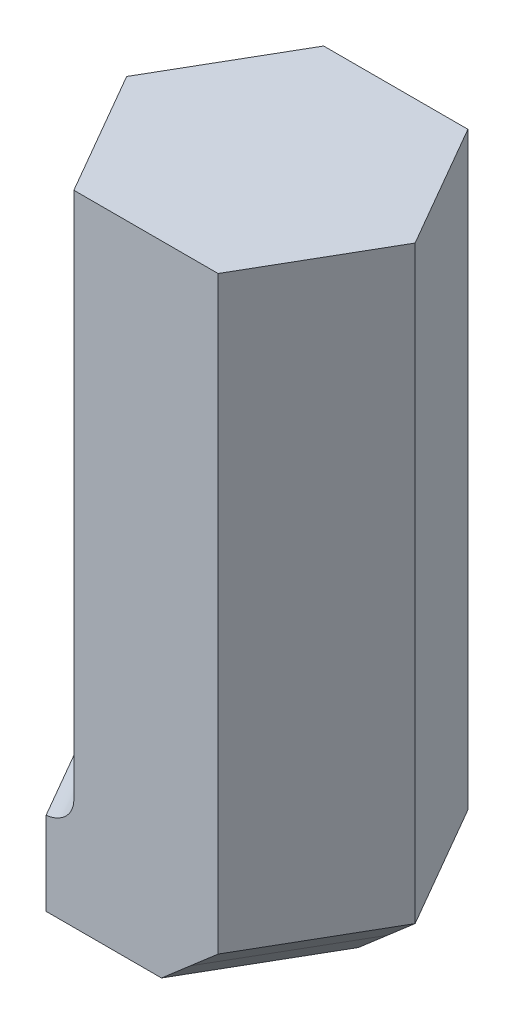
ISO-10303-21;
HEADER;
FILE_DESCRIPTION(('STEP AP214'),'2;1');
FILE_NAME('part.step','',(''),(''),'','','');
FILE_SCHEMA(('AUTOMOTIVE_DESIGN { 1 0 10303 214 1 1 1 1 }'));
ENDSEC;
DATA;
#1=APPLICATION_CONTEXT('core data for automotive mechanical design processes');
#2=APPLICATION_PROTOCOL_DEFINITION('international standard','automotive_design',2000,#1);
#3=PRODUCT_CONTEXT('',#1,'mechanical');
#4=PRODUCT('Part','Part','',(#3));
#5=PRODUCT_RELATED_PRODUCT_CATEGORY('part','',(#4));
#6=PRODUCT_DEFINITION_FORMATION('','',#4);
#7=PRODUCT_DEFINITION_CONTEXT('part definition',#1,'design');
#8=PRODUCT_DEFINITION('design','',#6,#7);
#9=PRODUCT_DEFINITION_SHAPE('','',#8);
#10=(LENGTH_UNIT() NAMED_UNIT(*) SI_UNIT(.MILLI.,.METRE.));
#11=(NAMED_UNIT(*) PLANE_ANGLE_UNIT() SI_UNIT($,.RADIAN.));
#12=(NAMED_UNIT(*) SI_UNIT($,.STERADIAN.) SOLID_ANGLE_UNIT());
#13=UNCERTAINTY_MEASURE_WITH_UNIT(LENGTH_MEASURE(1.E-05),#10,'distance_accuracy_value','');
#14=(GEOMETRIC_REPRESENTATION_CONTEXT(3) GLOBAL_UNCERTAINTY_ASSIGNED_CONTEXT((#13)) GLOBAL_UNIT_ASSIGNED_CONTEXT((#10,
#11,#12)) REPRESENTATION_CONTEXT('',''));
#15=CARTESIAN_POINT('',(0.,0.,0.));
#16=DIRECTION('',(0.,0.,1.));
#17=DIRECTION('',(1.,0.,0.));
#18=AXIS2_PLACEMENT_3D('',#15,#16,#17);
#19=CARTESIAN_POINT('',(-2.59807621135335,20.,4.49999999999998));
#20=DIRECTION('',(0.,0.,-1.));
#21=DIRECTION('',(-1.,0.,0.));
#22=AXIS2_PLACEMENT_3D('',#19,#20,#21);
#23=PLANE('',#22);
#24=DIRECTION('',(-1.,0.,0.));
#25=VECTOR('',#24,1.);
#26=CARTESIAN_POINT('',(1.59807621135331,-3.,4.50000000000002));
#27=LINE('',#26,#25);
#28=CARTESIAN_POINT('',(0.558845726811986,-3.,4.50000000000002));
#29=VERTEX_POINT('',#28);
#30=CARTESIAN_POINT('',(-3.59807621135332,-3.,4.50000000000002));
#31=VERTEX_POINT('',#30);
#32=EDGE_CURVE('E144',#29,#31,#27,.T.);
#33=ORIENTED_EDGE('',*,*,#32,.F.);
#34=DIRECTION('',(0.755928946018452,0.65465367070798,0.));
#35=VECTOR('',#34,1.);
#36=CARTESIAN_POINT('',(1.59247185641883,-2.10485351374509,4.50000000000001));
#37=LINE('',#36,#35);
#38=CARTESIAN_POINT('',(1.59807621135331,-2.10000000000004,4.50000000000002));
#39=VERTEX_POINT('',#38);
#40=EDGE_CURVE('E209',#29,#39,#37,.T.);
#41=ORIENTED_EDGE('',*,*,#40,.T.);
#42=DIRECTION('',(-0.75592894601845,-0.654653670707983,0.));
#43=VECTOR('',#42,1.);
#44=CARTESIAN_POINT('',(10.1369384975988,5.2948716593055,4.50000000000007));
#45=LINE('',#44,#43);
#46=CARTESIAN_POINT('',(2.59807621135329,-1.23397459621562,4.50000000000002));
#47=VERTEX_POINT('',#46);
#48=EDGE_CURVE('E196',#39,#47,#45,.F.);
#49=ORIENTED_EDGE('',*,*,#48,.T.);
#50=DIRECTION('',(0.,-1.,0.));
#51=VECTOR('',#50,1.);
#52=CARTESIAN_POINT('',(2.59807621135329,20.,4.50000000000002));
#53=LINE('',#52,#51);
#54=CARTESIAN_POINT('',(2.59807621135329,20.,4.50000000000002));
#55=VERTEX_POINT('',#54);
#56=EDGE_CURVE('E183',#55,#47,#53,.T.);
#57=ORIENTED_EDGE('',*,*,#56,.F.);
#58=DIRECTION('',(1.,0.,0.));
#59=VECTOR('',#58,1.);
#60=CARTESIAN_POINT('',(-2.59807621135335,20.,4.49999999999998));
#61=LINE('',#60,#59);
#62=CARTESIAN_POINT('',(-2.59807621135335,20.,4.49999999999998));
#63=VERTEX_POINT('',#62);
#64=EDGE_CURVE('E154',#63,#55,#61,.T.);
#65=ORIENTED_EDGE('',*,*,#64,.F.);
#66=DIRECTION('',(0.,-1.,0.));
#67=VECTOR('',#66,1.);
#68=CARTESIAN_POINT('',(-2.59807621135335,20.,4.49999999999998));
#69=LINE('',#68,#67);
#70=CARTESIAN_POINT('',(-2.59807621135335,0.990984766567518,4.49999999999998));
#71=VERTEX_POINT('',#70);
#72=EDGE_CURVE('E172',#63,#71,#69,.T.);
#73=ORIENTED_EDGE('',*,*,#72,.T.);
#74=CARTESIAN_POINT('',(-3.75277674973258,0.990984766567519,4.49999999999997));
#75=DIRECTION('',(0.,0.,-1.));
#76=DIRECTION('',(1.,0.,0.));
#77=AXIS2_PLACEMENT_3D('',#74,#75,#76);
#78=ELLIPSE('',#77,1.15470053837926,1.);
#79=CARTESIAN_POINT('',(-3.59807621135332,0.,4.50000000000002));
#80=VERTEX_POINT('',#79);
#81=EDGE_CURVE('E46',#71,#80,#78,.T.);
#82=ORIENTED_EDGE('',*,*,#81,.T.);
#83=DIRECTION('',(0.,1.,0.));
#84=VECTOR('',#83,1.);
#85=CARTESIAN_POINT('',(-3.59807621135332,-3.,4.50000000000002));
#86=LINE('',#85,#84);
#87=EDGE_CURVE('E159',#31,#80,#86,.T.);
#88=ORIENTED_EDGE('',*,*,#87,.F.);
#89=EDGE_LOOP('',(#33,#41,#49,#57,#65,#73,#82,#88));
#90=FACE_BOUND('',#89,.T.);
#91=ADVANCED_FACE('F37',(#90),#23,.F.);
#92=CARTESIAN_POINT('',(2.59807621135329,20.,4.50000000000002));
#93=DIRECTION('',(-0.866025403784435,0.,-0.500000000000006));
#94=DIRECTION('',(-0.500000000000006,0.,0.866025403784435));
#95=AXIS2_PLACEMENT_3D('',#92,#93,#94);
#96=PLANE('',#95);
#97=ORIENTED_EDGE('',*,*,#56,.T.);
#98=DIRECTION('',(-0.500000000000006,0.,0.866025403784435));
#99=VECTOR('',#98,1.);
#100=CARTESIAN_POINT('',(2.59807621135336,-1.23397459621562,4.49999999999989));
#101=LINE('',#100,#99);
#102=CARTESIAN_POINT('',(5.19615242270663,-1.2339745962156,0.));
#103=VERTEX_POINT('',#102);
#104=EDGE_CURVE('E199',#47,#103,#101,.F.);
#105=ORIENTED_EDGE('',*,*,#104,.T.);
#106=DIRECTION('',(0.,-1.,0.));
#107=VECTOR('',#106,1.);
#108=CARTESIAN_POINT('',(5.19615242270663,20.,0.));
#109=LINE('',#108,#107);
#110=CARTESIAN_POINT('',(5.19615242270663,20.,0.));
#111=VERTEX_POINT('',#110);
#112=EDGE_CURVE('E181',#111,#103,#109,.T.);
#113=ORIENTED_EDGE('',*,*,#112,.F.);
#114=DIRECTION('',(0.500000000000006,0.,-0.866025403784435));
#115=VECTOR('',#114,1.);
#116=CARTESIAN_POINT('',(2.59807621135329,20.,4.50000000000002));
#117=LINE('',#116,#115);
#118=EDGE_CURVE('E157',#55,#111,#117,.T.);
#119=ORIENTED_EDGE('',*,*,#118,.F.);
#120=EDGE_LOOP('',(#97,#105,#113,#119));
#121=FACE_BOUND('',#120,.T.);
#122=ADVANCED_FACE('F250',(#121),#96,.F.);
#123=CARTESIAN_POINT('',(5.19615242270663,20.,0.));
#124=DIRECTION('',(-0.866025403784442,0.,0.499999999999994));
#125=DIRECTION('',(0.499999999999994,0.,0.866025403784442));
#126=AXIS2_PLACEMENT_3D('',#123,#124,#125);
#127=PLANE('',#126);
#128=ORIENTED_EDGE('',*,*,#112,.T.);
#129=DIRECTION('',(0.499999999999994,0.,0.866025403784442));
#130=VECTOR('',#129,1.);
#131=CARTESIAN_POINT('',(5.19615242270656,-1.23397459621559,0.));
#132=LINE('',#131,#130);
#133=CARTESIAN_POINT('',(2.59807621135335,-1.23397459621556,-4.49999999999998));
#134=VERTEX_POINT('',#133);
#135=EDGE_CURVE('E191',#103,#134,#132,.F.);
#136=ORIENTED_EDGE('',*,*,#135,.T.);
#137=DIRECTION('',(0.,-1.,0.));
#138=VECTOR('',#137,1.);
#139=CARTESIAN_POINT('',(2.59807621135335,20.,-4.49999999999998));
#140=LINE('',#139,#138);
#141=CARTESIAN_POINT('',(2.59807621135335,20.,-4.49999999999998));
#142=VERTEX_POINT('',#141);
#143=EDGE_CURVE('E179',#142,#134,#140,.T.);
#144=ORIENTED_EDGE('',*,*,#143,.F.);
#145=DIRECTION('',(-0.499999999999994,0.,-0.866025403784442));
#146=VECTOR('',#145,1.);
#147=CARTESIAN_POINT('',(5.19615242270663,20.,0.));
#148=LINE('',#147,#146);
#149=EDGE_CURVE('E164',#111,#142,#148,.T.);
#150=ORIENTED_EDGE('',*,*,#149,.F.);
#151=EDGE_LOOP('',(#128,#136,#144,#150));
#152=FACE_BOUND('',#151,.T.);
#153=ADVANCED_FACE('F257',(#152),#127,.F.);
#154=CARTESIAN_POINT('',(2.59807621135335,20.,-4.49999999999998));
#155=DIRECTION('',(0.,0.,1.));
#156=DIRECTION('',(1.,0.,0.));
#157=AXIS2_PLACEMENT_3D('',#154,#155,#156);
#158=PLANE('',#157);
#159=DIRECTION('',(0.755928946018452,0.65465367070798,0.));
#160=VECTOR('',#159,1.);
#161=CARTESIAN_POINT('',(13.1061684534311,7.86630023073404,-4.49999999999991));
#162=LINE('',#161,#160);
#163=CARTESIAN_POINT('',(1.59807621135332,-2.10000000000004,-4.49999999999998));
#164=VERTEX_POINT('',#163);
#165=EDGE_CURVE('E194',#134,#164,#162,.F.);
#166=ORIENTED_EDGE('',*,*,#165,.T.);
#167=DIRECTION('',(-0.755928946018455,-0.654653670707977,0.));
#168=VECTOR('',#167,1.);
#169=CARTESIAN_POINT('',(1.59247185641884,-2.10485351374507,-4.49999999999999));
#170=LINE('',#169,#168);
#171=CARTESIAN_POINT('',(0.558845726811986,-3.,-4.49999999999998));
#172=VERTEX_POINT('',#171);
#173=EDGE_CURVE('E211',#164,#172,#170,.T.);
#174=ORIENTED_EDGE('',*,*,#173,.T.);
#175=DIRECTION('',(1.,0.,0.));
#176=VECTOR('',#175,1.);
#177=CARTESIAN_POINT('',(-3.59807621135331,-3.,-4.49999999999998));
#178=LINE('',#177,#176);
#179=CARTESIAN_POINT('',(-3.59807621135331,-3.,-4.49999999999998));
#180=VERTEX_POINT('',#179);
#181=EDGE_CURVE('E137',#180,#172,#178,.T.);
#182=ORIENTED_EDGE('',*,*,#181,.F.);
#183=DIRECTION('',(0.,1.,0.));
#184=VECTOR('',#183,1.);
#185=CARTESIAN_POINT('',(-3.59807621135331,-3.,-4.49999999999998));
#186=LINE('',#185,#184);
#187=CARTESIAN_POINT('',(-3.59807621135331,0.,-4.49999999999998));
#188=VERTEX_POINT('',#187);
#189=EDGE_CURVE('E133',#180,#188,#186,.T.);
#190=ORIENTED_EDGE('',*,*,#189,.T.);
#191=CARTESIAN_POINT('',(-3.75277674973255,0.990984766567517,-4.50000000000003));
#192=DIRECTION('',(0.,0.,1.));
#193=DIRECTION('',(-1.,0.,0.));
#194=AXIS2_PLACEMENT_3D('',#191,#192,#193);
#195=ELLIPSE('',#194,1.15470053837925,1.);
#196=CARTESIAN_POINT('',(-2.59807621135328,0.990984766567518,-4.50000000000002));
#197=VERTEX_POINT('',#196);
#198=EDGE_CURVE('E11',#188,#197,#195,.T.);
#199=ORIENTED_EDGE('',*,*,#198,.T.);
#200=DIRECTION('',(0.,-1.,0.));
#201=VECTOR('',#200,1.);
#202=CARTESIAN_POINT('',(-2.59807621135328,20.,-4.50000000000002));
#203=LINE('',#202,#201);
#204=CARTESIAN_POINT('',(-2.59807621135328,20.,-4.50000000000002));
#205=VERTEX_POINT('',#204);
#206=EDGE_CURVE('E177',#205,#197,#203,.T.);
#207=ORIENTED_EDGE('',*,*,#206,.F.);
#208=DIRECTION('',(-1.,0.,0.));
#209=VECTOR('',#208,1.);
#210=CARTESIAN_POINT('',(2.59807621135335,20.,-4.49999999999998));
#211=LINE('',#210,#209);
#212=EDGE_CURVE('E166',#142,#205,#211,.T.);
#213=ORIENTED_EDGE('',*,*,#212,.F.);
#214=ORIENTED_EDGE('',*,*,#143,.T.);
#215=EDGE_LOOP('',(#166,#174,#182,#190,#199,#207,#213,#214));
#216=FACE_BOUND('',#215,.T.);
#217=ADVANCED_FACE('F266',(#216),#158,.F.);
#218=CARTESIAN_POINT('',(-2.59807621135328,20.,-4.50000000000002));
#219=DIRECTION('',(0.866025403784435,0.,0.500000000000006));
#220=DIRECTION('',(0.500000000000006,0.,-0.866025403784435));
#221=AXIS2_PLACEMENT_3D('',#218,#219,#220);
#222=PLANE('',#221);
#223=ORIENTED_EDGE('',*,*,#206,.T.);
#224=DIRECTION('',(-0.500000000000006,0.,0.866025403784435));
#225=VECTOR('',#224,1.);
#226=CARTESIAN_POINT('',(-2.59807621135328,0.990984766567518,-4.50000000000002));
#227=LINE('',#226,#225);
#228=CARTESIAN_POINT('',(-5.19615242270663,0.990984766567518,0.));
#229=VERTEX_POINT('',#228);
#230=EDGE_CURVE('E58',#197,#229,#227,.T.);
#231=ORIENTED_EDGE('',*,*,#230,.T.);
#232=DIRECTION('',(0.,-1.,0.));
#233=VECTOR('',#232,1.);
#234=CARTESIAN_POINT('',(-5.19615242270663,20.,0.));
#235=LINE('',#234,#233);
#236=CARTESIAN_POINT('',(-5.19615242270663,20.,0.));
#237=VERTEX_POINT('',#236);
#238=EDGE_CURVE('E175',#237,#229,#235,.T.);
#239=ORIENTED_EDGE('',*,*,#238,.F.);
#240=DIRECTION('',(-0.500000000000006,0.,0.866025403784435));
#241=VECTOR('',#240,1.);
#242=CARTESIAN_POINT('',(-2.59807621135328,20.,-4.50000000000002));
#243=LINE('',#242,#241);
#244=EDGE_CURVE('E168',#205,#237,#243,.T.);
#245=ORIENTED_EDGE('',*,*,#244,.F.);
#246=EDGE_LOOP('',(#223,#231,#239,#245));
#247=FACE_BOUND('',#246,.T.);
#248=ADVANCED_FACE('F268',(#247),#222,.F.);
#249=CARTESIAN_POINT('',(-5.19615242270663,20.,0.));
#250=DIRECTION('',(0.866025403784442,0.,-0.499999999999994));
#251=DIRECTION('',(-0.499999999999994,0.,-0.866025403784442));
#252=AXIS2_PLACEMENT_3D('',#249,#250,#251);
#253=PLANE('',#252);
#254=ORIENTED_EDGE('',*,*,#238,.T.);
#255=DIRECTION('',(0.499999999999994,0.,0.866025403784442));
#256=VECTOR('',#255,1.);
#257=CARTESIAN_POINT('',(-5.19615242270663,0.990984766567518,0.));
#258=LINE('',#257,#256);
#259=EDGE_CURVE('E213',#229,#71,#258,.T.);
#260=ORIENTED_EDGE('',*,*,#259,.T.);
#261=ORIENTED_EDGE('',*,*,#72,.F.);
#262=DIRECTION('',(0.499999999999994,0.,0.866025403784442));
#263=VECTOR('',#262,1.);
#264=CARTESIAN_POINT('',(-5.19615242270663,20.,0.));
#265=LINE('',#264,#263);
#266=EDGE_CURVE('E170',#237,#63,#265,.T.);
#267=ORIENTED_EDGE('',*,*,#266,.F.);
#268=EDGE_LOOP('',(#254,#260,#261,#267));
#269=FACE_BOUND('',#268,.T.);
#270=ADVANCED_FACE('F264',(#269),#253,.F.);
#271=CARTESIAN_POINT('',(0.,20.,0.));
#272=DIRECTION('',(0.,1.,0.));
#273=DIRECTION('',(0.,0.,1.));
#274=AXIS2_PLACEMENT_3D('',#271,#272,#273);
#275=PLANE('',#274);
#276=ORIENTED_EDGE('',*,*,#64,.T.);
#277=ORIENTED_EDGE('',*,*,#118,.T.);
#278=ORIENTED_EDGE('',*,*,#149,.T.);
#279=ORIENTED_EDGE('',*,*,#212,.T.);
#280=ORIENTED_EDGE('',*,*,#244,.T.);
#281=ORIENTED_EDGE('',*,*,#266,.T.);
#282=EDGE_LOOP('',(#276,#277,#278,#279,#280,#281));
#283=FACE_BOUND('',#282,.T.);
#284=ADVANCED_FACE('F260',(#283),#275,.T.);
#285=CARTESIAN_POINT('',(-3.59807621135332,-3.,4.50000000000002));
#286=DIRECTION('',(0.866025403784439,0.,-0.5));
#287=DIRECTION('',(-0.5,0.,-0.866025403784439));
#288=AXIS2_PLACEMENT_3D('',#285,#286,#287);
#289=PLANE('',#288);
#290=DIRECTION('',(-0.5,0.,-0.866025403784439));
#291=VECTOR('',#290,1.);
#292=CARTESIAN_POINT('',(-3.59807621135332,0.,4.50000000000002));
#293=LINE('',#292,#291);
#294=CARTESIAN_POINT('',(-6.19615242270663,0.,0.));
#295=VERTEX_POINT('',#294);
#296=EDGE_CURVE('E152',#80,#295,#293,.T.);
#297=ORIENTED_EDGE('',*,*,#296,.T.);
#298=DIRECTION('',(0.,1.,0.));
#299=VECTOR('',#298,1.);
#300=CARTESIAN_POINT('',(-6.19615242270663,-3.,0.));
#301=LINE('',#300,#299);
#302=CARTESIAN_POINT('',(-6.19615242270663,-3.,0.));
#303=VERTEX_POINT('',#302);
#304=EDGE_CURVE('E131',#303,#295,#301,.T.);
#305=ORIENTED_EDGE('',*,*,#304,.F.);
#306=DIRECTION('',(-0.5,0.,-0.866025403784439));
#307=VECTOR('',#306,1.);
#308=CARTESIAN_POINT('',(-3.59807621135332,-3.,4.50000000000002));
#309=LINE('',#308,#307);
#310=EDGE_CURVE('E138',#31,#303,#309,.T.);
#311=ORIENTED_EDGE('',*,*,#310,.F.);
#312=ORIENTED_EDGE('',*,*,#87,.T.);
#313=EDGE_LOOP('',(#297,#305,#311,#312));
#314=FACE_BOUND('',#313,.T.);
#315=ADVANCED_FACE('F150',(#314),#289,.F.);
#316=CARTESIAN_POINT('',(-6.19615242270663,-3.,0.));
#317=DIRECTION('',(0.866025403784438,0.,0.5));
#318=DIRECTION('',(0.5,0.,-0.866025403784438));
#319=AXIS2_PLACEMENT_3D('',#316,#317,#318);
#320=PLANE('',#319);
#321=DIRECTION('',(0.5,0.,-0.866025403784438));
#322=VECTOR('',#321,1.);
#323=CARTESIAN_POINT('',(-6.19615242270663,0.,0.));
#324=LINE('',#323,#322);
#325=EDGE_CURVE('E148',#295,#188,#324,.T.);
#326=ORIENTED_EDGE('',*,*,#325,.T.);
#327=ORIENTED_EDGE('',*,*,#189,.F.);
#328=DIRECTION('',(0.5,0.,-0.866025403784438));
#329=VECTOR('',#328,1.);
#330=CARTESIAN_POINT('',(-6.19615242270663,-3.,0.));
#331=LINE('',#330,#329);
#332=EDGE_CURVE('E127',#303,#180,#331,.T.);
#333=ORIENTED_EDGE('',*,*,#332,.F.);
#334=ORIENTED_EDGE('',*,*,#304,.T.);
#335=EDGE_LOOP('',(#326,#327,#333,#334));
#336=FACE_BOUND('',#335,.T.);
#337=ADVANCED_FACE('F129',(#336),#320,.F.);
#338=CARTESIAN_POINT('',(0.,-3.,0.));
#339=DIRECTION('',(0.,-1.,0.));
#340=DIRECTION('',(0.,0.,-1.));
#341=AXIS2_PLACEMENT_3D('',#338,#339,#340);
#342=PLANE('',#341);
#343=DIRECTION('',(0.5,0.,0.866025403784439));
#344=VECTOR('',#343,1.);
#345=CARTESIAN_POINT('',(3.41672955930063,-3.,0.450000000000022));
#346=LINE('',#345,#344);
#347=CARTESIAN_POINT('',(3.1569219381653,-3.,0.));
#348=VERTEX_POINT('',#347);
#349=EDGE_CURVE('E202',#172,#348,#346,.T.);
#350=ORIENTED_EDGE('',*,*,#349,.T.);
#351=DIRECTION('',(-0.5,0.,0.866025403784439));
#352=VECTOR('',#351,1.);
#353=CARTESIAN_POINT('',(0.818653347947318,-3.,4.05000000000002));
#354=LINE('',#353,#352);
#355=EDGE_CURVE('E207',#348,#29,#354,.T.);
#356=ORIENTED_EDGE('',*,*,#355,.T.);
#357=ORIENTED_EDGE('',*,*,#32,.T.);
#358=ORIENTED_EDGE('',*,*,#310,.T.);
#359=ORIENTED_EDGE('',*,*,#332,.T.);
#360=ORIENTED_EDGE('',*,*,#181,.T.);
#361=EDGE_LOOP('',(#350,#356,#357,#358,#359,#360));
#362=FACE_BOUND('',#361,.T.);
#363=ADVANCED_FACE('F141',(#362),#342,.T.);
#364=CARTESIAN_POINT('',(4.19615242270663,-2.10000000000004,0.));
#365=DIRECTION('',(0.612372435695798,-0.707106781186544,0.353553390593276));
#366=DIRECTION('',(0.5,0.,-0.866025403784439));
#367=AXIS2_PLACEMENT_3D('',#364,#365,#366);
#368=PLANE('',#367);
#369=ORIENTED_EDGE('',*,*,#48,.F.);
#370=DIRECTION('',(-0.5,0.,0.866025403784439));
#371=VECTOR('',#370,1.);
#372=CARTESIAN_POINT('',(1.59807621135332,-2.10000000000004,4.50000000000001));
#373=LINE('',#372,#371);
#374=CARTESIAN_POINT('',(4.19615242270663,-2.10000000000004,0.));
#375=VERTEX_POINT('',#374);
#376=EDGE_CURVE('E188',#375,#39,#373,.T.);
#377=ORIENTED_EDGE('',*,*,#376,.F.);
#378=DIRECTION('',(-0.755928946018451,-0.654653670707981,0.));
#379=VECTOR('',#378,1.);
#380=CARTESIAN_POINT('',(2.71153744479046,-3.38571428571433,0.));
#381=LINE('',#380,#379);
#382=EDGE_CURVE('E203',#103,#375,#381,.T.);
#383=ORIENTED_EDGE('',*,*,#382,.F.);
#384=ORIENTED_EDGE('',*,*,#104,.F.);
#385=EDGE_LOOP('',(#369,#377,#383,#384));
#386=FACE_BOUND('',#385,.T.);
#387=ADVANCED_FACE('F245',(#386),#368,.T.);
#388=CARTESIAN_POINT('',(1.59807621135332,-2.10000000000004,-4.49999999999998));
#389=DIRECTION('',(0.612372435695798,-0.707106781186543,-0.353553390593276));
#390=DIRECTION('',(-0.5,0.,-0.866025403784439));
#391=AXIS2_PLACEMENT_3D('',#388,#389,#390);
#392=PLANE('',#391);
#393=ORIENTED_EDGE('',*,*,#165,.F.);
#394=ORIENTED_EDGE('',*,*,#135,.F.);
#395=ORIENTED_EDGE('',*,*,#382,.T.);
#396=DIRECTION('',(0.5,0.,0.866025403784439));
#397=VECTOR('',#396,1.);
#398=CARTESIAN_POINT('',(4.19615242270663,-2.10000000000004,0.));
#399=LINE('',#398,#397);
#400=EDGE_CURVE('E185',#164,#375,#399,.T.);
#401=ORIENTED_EDGE('',*,*,#400,.F.);
#402=EDGE_LOOP('',(#393,#394,#395,#401));
#403=FACE_BOUND('',#402,.T.);
#404=ADVANCED_FACE('F254',(#403),#392,.T.);
#405=CARTESIAN_POINT('',(2.36769145362397,-3.,-1.36698729810777));
#406=DIRECTION('',(0.612372435695795,-0.707106781186547,-0.353553390593274));
#407=DIRECTION('',(-0.5,0.,-0.866025403784439));
#408=AXIS2_PLACEMENT_3D('',#405,#406,#407);
#409=PLANE('',#408);
#410=ORIENTED_EDGE('',*,*,#173,.F.);
#411=ORIENTED_EDGE('',*,*,#400,.T.);
#412=DIRECTION('',(-0.755928946018454,-0.654653670707978,0.));
#413=VECTOR('',#412,1.);
#414=CARTESIAN_POINT('',(2.70593308985597,-3.39056779945937,0.));
#415=LINE('',#414,#413);
#416=EDGE_CURVE('E205',#348,#375,#415,.F.);
#417=ORIENTED_EDGE('',*,*,#416,.F.);
#418=ORIENTED_EDGE('',*,*,#349,.F.);
#419=EDGE_LOOP('',(#410,#411,#417,#418));
#420=FACE_BOUND('',#419,.T.);
#421=ADVANCED_FACE('F235',(#420),#409,.T.);
#422=CARTESIAN_POINT('',(2.36769145362399,-3.,1.36698729810778));
#423=DIRECTION('',(0.612372435695795,-0.707106781186547,0.353553390593274));
#424=DIRECTION('',(0.5,0.,-0.866025403784439));
#425=AXIS2_PLACEMENT_3D('',#422,#423,#424);
#426=PLANE('',#425);
#427=ORIENTED_EDGE('',*,*,#416,.T.);
#428=ORIENTED_EDGE('',*,*,#376,.T.);
#429=ORIENTED_EDGE('',*,*,#40,.F.);
#430=ORIENTED_EDGE('',*,*,#355,.F.);
#431=EDGE_LOOP('',(#427,#428,#429,#430));
#432=FACE_BOUND('',#431,.T.);
#433=ADVANCED_FACE('F239',(#432),#426,.T.);
#434=CARTESIAN_POINT('',(-4.76313972081441,0.990984766567517,-2.75));
#435=DIRECTION('',(-0.5,0.,0.866025403784438));
#436=DIRECTION('',(0.866025403784438,0.,0.5));
#437=AXIS2_PLACEMENT_3D('',#434,#435,#436);
#438=CYLINDRICAL_SURFACE('',#437,1.);
#439=ORIENTED_EDGE('',*,*,#198,.F.);
#440=ORIENTED_EDGE('',*,*,#325,.F.);
#441=CARTESIAN_POINT('',(-6.35085296108588,0.990984766567518,0.));
#442=DIRECTION('',(0.,0.,1.));
#443=DIRECTION('',(1.,0.,0.));
#444=AXIS2_PLACEMENT_3D('',#441,#442,#443);
#445=ELLIPSE('',#444,1.15470053837925,1.);
#446=EDGE_CURVE('E41',#229,#295,#445,.F.);
#447=ORIENTED_EDGE('',*,*,#446,.F.);
#448=ORIENTED_EDGE('',*,*,#230,.F.);
#449=EDGE_LOOP('',(#439,#440,#447,#448));
#450=FACE_BOUND('',#449,.T.);
#451=ADVANCED_FACE('F39',(#450),#438,.F.);
#452=CARTESIAN_POINT('',(-4.76313972081441,0.990984766567519,2.75));
#453=DIRECTION('',(0.5,0.,0.866025403784439));
#454=DIRECTION('',(0.866025403784439,0.,-0.5));
#455=AXIS2_PLACEMENT_3D('',#452,#453,#454);
#456=CYLINDRICAL_SURFACE('',#455,1.);
#457=ORIENTED_EDGE('',*,*,#446,.T.);
#458=ORIENTED_EDGE('',*,*,#296,.F.);
#459=ORIENTED_EDGE('',*,*,#81,.F.);
#460=ORIENTED_EDGE('',*,*,#259,.F.);
#461=EDGE_LOOP('',(#457,#458,#459,#460));
#462=FACE_BOUND('',#461,.T.);
#463=ADVANCED_FACE('F225',(#462),#456,.F.);
#464=CLOSED_SHELL('',(#91,#122,#153,#217,#248,#270,#284,#315,#337,#363,#387,#404,#421,#433,#451,#463));
#465=MANIFOLD_SOLID_BREP('B2',#464);
#466=ADVANCED_BREP_SHAPE_REPRESENTATION('',(#18,#465),#14);
#467=SHAPE_DEFINITION_REPRESENTATION(#9,#466);
ENDSEC;
END-ISO-10303-21;
